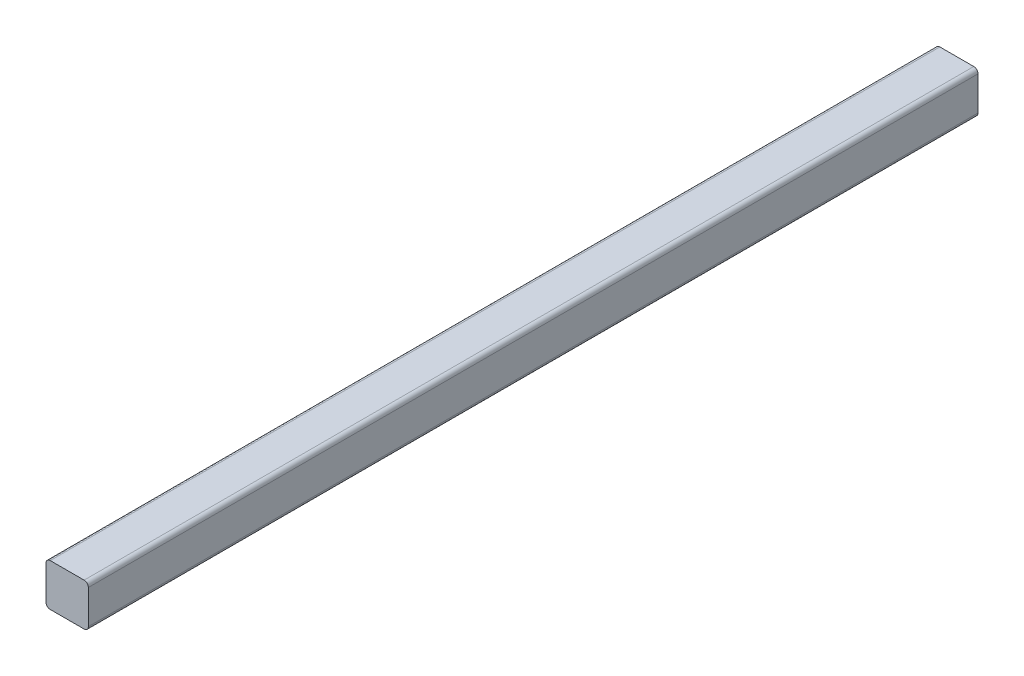
ISO-10303-21;
HEADER;
FILE_DESCRIPTION(('STEP AP214'),'2;1');
FILE_NAME('part.step','',(''),(''),'','','');
FILE_SCHEMA(('AUTOMOTIVE_DESIGN { 1 0 10303 214 1 1 1 1 }'));
ENDSEC;
DATA;
#1=APPLICATION_CONTEXT('core data for automotive mechanical design processes');
#2=APPLICATION_PROTOCOL_DEFINITION('international standard','automotive_design',2000,#1);
#3=PRODUCT_CONTEXT('',#1,'mechanical');
#4=PRODUCT('Part','Part','',(#3));
#5=PRODUCT_RELATED_PRODUCT_CATEGORY('part','',(#4));
#6=PRODUCT_DEFINITION_FORMATION('','',#4);
#7=PRODUCT_DEFINITION_CONTEXT('part definition',#1,'design');
#8=PRODUCT_DEFINITION('design','',#6,#7);
#9=PRODUCT_DEFINITION_SHAPE('','',#8);
#10=(LENGTH_UNIT() NAMED_UNIT(*) SI_UNIT(.MILLI.,.METRE.));
#11=(NAMED_UNIT(*) PLANE_ANGLE_UNIT() SI_UNIT($,.RADIAN.));
#12=(NAMED_UNIT(*) SI_UNIT($,.STERADIAN.) SOLID_ANGLE_UNIT());
#13=UNCERTAINTY_MEASURE_WITH_UNIT(LENGTH_MEASURE(1.E-05),#10,'distance_accuracy_value','');
#14=(GEOMETRIC_REPRESENTATION_CONTEXT(3) GLOBAL_UNCERTAINTY_ASSIGNED_CONTEXT((#13)) GLOBAL_UNIT_ASSIGNED_CONTEXT((#10,
#11,#12)) REPRESENTATION_CONTEXT('',''));
#15=CARTESIAN_POINT('',(0.,0.,0.));
#16=DIRECTION('',(0.,0.,1.));
#17=DIRECTION('',(1.,0.,0.));
#18=AXIS2_PLACEMENT_3D('',#15,#16,#17);
#19=CARTESIAN_POINT('',(2.5,2.5,-105.));
#20=DIRECTION('',(1.,0.,0.));
#21=DIRECTION('',(0.,1.,0.));
#22=AXIS2_PLACEMENT_3D('',#19,#20,#21);
#23=PLANE('',#22);
#24=DIRECTION('',(0.,1.,0.));
#25=VECTOR('',#24,1.);
#26=CARTESIAN_POINT('',(2.5,2.5,0.));
#27=LINE('',#26,#25);
#28=CARTESIAN_POINT('',(2.5,-2.,0.));
#29=VERTEX_POINT('',#28);
#30=CARTESIAN_POINT('',(2.5,2.,0.));
#31=VERTEX_POINT('',#30);
#32=EDGE_CURVE('E160',#29,#31,#27,.T.);
#33=ORIENTED_EDGE('',*,*,#32,.F.);
#34=DIRECTION('',(0.,0.,1.));
#35=VECTOR('',#34,1.);
#36=CARTESIAN_POINT('',(2.5,-2.,-105.));
#37=LINE('',#36,#35);
#38=CARTESIAN_POINT('',(2.5,-2.,-105.));
#39=VERTEX_POINT('',#38);
#40=EDGE_CURVE('E140',#29,#39,#37,.F.);
#41=ORIENTED_EDGE('',*,*,#40,.T.);
#42=DIRECTION('',(0.,1.,0.));
#43=VECTOR('',#42,1.);
#44=CARTESIAN_POINT('',(2.5,2.5,-105.));
#45=LINE('',#44,#43);
#46=CARTESIAN_POINT('',(2.5,2.,-105.));
#47=VERTEX_POINT('',#46);
#48=EDGE_CURVE('E121',#39,#47,#45,.T.);
#49=ORIENTED_EDGE('',*,*,#48,.T.);
#50=DIRECTION('',(0.,0.,1.));
#51=VECTOR('',#50,1.);
#52=CARTESIAN_POINT('',(2.5,2.,-105.));
#53=LINE('',#52,#51);
#54=EDGE_CURVE('E137',#47,#31,#53,.T.);
#55=ORIENTED_EDGE('',*,*,#54,.T.);
#56=EDGE_LOOP('',(#33,#41,#49,#55));
#57=FACE_BOUND('',#56,.T.);
#58=ADVANCED_FACE('F34',(#57),#23,.T.);
#59=CARTESIAN_POINT('',(-2.5,-2.5,-105.));
#60=DIRECTION('',(0.,-1.,0.));
#61=DIRECTION('',(0.,0.,-1.));
#62=AXIS2_PLACEMENT_3D('',#59,#60,#61);
#63=PLANE('',#62);
#64=DIRECTION('',(1.,0.,0.));
#65=VECTOR('',#64,1.);
#66=CARTESIAN_POINT('',(-2.5,-2.5,-105.));
#67=LINE('',#66,#65);
#68=CARTESIAN_POINT('',(-2.,-2.5,-105.));
#69=VERTEX_POINT('',#68);
#70=CARTESIAN_POINT('',(2.,-2.5,-105.));
#71=VERTEX_POINT('',#70);
#72=EDGE_CURVE('E126',#69,#71,#67,.T.);
#73=ORIENTED_EDGE('',*,*,#72,.T.);
#74=DIRECTION('',(0.,0.,1.));
#75=VECTOR('',#74,1.);
#76=CARTESIAN_POINT('',(2.,-2.5,-105.));
#77=LINE('',#76,#75);
#78=CARTESIAN_POINT('',(2.,-2.5,0.));
#79=VERTEX_POINT('',#78);
#80=EDGE_CURVE('E120',#71,#79,#77,.T.);
#81=ORIENTED_EDGE('',*,*,#80,.T.);
#82=DIRECTION('',(1.,0.,0.));
#83=VECTOR('',#82,1.);
#84=CARTESIAN_POINT('',(-2.5,-2.5,0.));
#85=LINE('',#84,#83);
#86=CARTESIAN_POINT('',(-2.,-2.5,0.));
#87=VERTEX_POINT('',#86);
#88=EDGE_CURVE('E103',#87,#79,#85,.T.);
#89=ORIENTED_EDGE('',*,*,#88,.F.);
#90=DIRECTION('',(0.,0.,1.));
#91=VECTOR('',#90,1.);
#92=CARTESIAN_POINT('',(-2.,-2.5,-105.));
#93=LINE('',#92,#91);
#94=EDGE_CURVE('E117',#87,#69,#93,.F.);
#95=ORIENTED_EDGE('',*,*,#94,.T.);
#96=EDGE_LOOP('',(#73,#81,#89,#95));
#97=FACE_BOUND('',#96,.T.);
#98=ADVANCED_FACE('F116',(#97),#63,.T.);
#99=CARTESIAN_POINT('',(-2.5,2.5,-105.));
#100=DIRECTION('',(-1.,0.,0.));
#101=DIRECTION('',(0.,-1.,0.));
#102=AXIS2_PLACEMENT_3D('',#99,#100,#101);
#103=PLANE('',#102);
#104=DIRECTION('',(0.,-1.,0.));
#105=VECTOR('',#104,1.);
#106=CARTESIAN_POINT('',(-2.5,2.5,-105.));
#107=LINE('',#106,#105);
#108=CARTESIAN_POINT('',(-2.5,2.,-105.));
#109=VERTEX_POINT('',#108);
#110=CARTESIAN_POINT('',(-2.5,-2.,-105.));
#111=VERTEX_POINT('',#110);
#112=EDGE_CURVE('E130',#109,#111,#107,.T.);
#113=ORIENTED_EDGE('',*,*,#112,.T.);
#114=DIRECTION('',(0.,0.,1.));
#115=VECTOR('',#114,1.);
#116=CARTESIAN_POINT('',(-2.5,-2.,-105.));
#117=LINE('',#116,#115);
#118=CARTESIAN_POINT('',(-2.5,-2.,0.));
#119=VERTEX_POINT('',#118);
#120=EDGE_CURVE('E150',#111,#119,#117,.T.);
#121=ORIENTED_EDGE('',*,*,#120,.T.);
#122=DIRECTION('',(0.,-1.,0.));
#123=VECTOR('',#122,1.);
#124=CARTESIAN_POINT('',(-2.5,2.5,0.));
#125=LINE('',#124,#123);
#126=CARTESIAN_POINT('',(-2.5,2.,0.));
#127=VERTEX_POINT('',#126);
#128=EDGE_CURVE('E105',#127,#119,#125,.T.);
#129=ORIENTED_EDGE('',*,*,#128,.F.);
#130=DIRECTION('',(0.,0.,1.));
#131=VECTOR('',#130,1.);
#132=CARTESIAN_POINT('',(-2.5,2.,-105.));
#133=LINE('',#132,#131);
#134=EDGE_CURVE('E148',#127,#109,#133,.F.);
#135=ORIENTED_EDGE('',*,*,#134,.T.);
#136=EDGE_LOOP('',(#113,#121,#129,#135));
#137=FACE_BOUND('',#136,.T.);
#138=ADVANCED_FACE('F153',(#137),#103,.T.);
#139=CARTESIAN_POINT('',(-2.5,2.5,-105.));
#140=DIRECTION('',(0.,1.,0.));
#141=DIRECTION('',(0.,0.,1.));
#142=AXIS2_PLACEMENT_3D('',#139,#140,#141);
#143=PLANE('',#142);
#144=DIRECTION('',(-1.,0.,0.));
#145=VECTOR('',#144,1.);
#146=CARTESIAN_POINT('',(-2.5,2.5,-105.));
#147=LINE('',#146,#145);
#148=CARTESIAN_POINT('',(2.,2.5,-105.));
#149=VERTEX_POINT('',#148);
#150=CARTESIAN_POINT('',(-2.,2.5,-105.));
#151=VERTEX_POINT('',#150);
#152=EDGE_CURVE('E155',#149,#151,#147,.T.);
#153=ORIENTED_EDGE('',*,*,#152,.T.);
#154=DIRECTION('',(0.,0.,1.));
#155=VECTOR('',#154,1.);
#156=CARTESIAN_POINT('',(-2.,2.5,-105.));
#157=LINE('',#156,#155);
#158=CARTESIAN_POINT('',(-2.,2.5,0.));
#159=VERTEX_POINT('',#158);
#160=EDGE_CURVE('E11',#151,#159,#157,.T.);
#161=ORIENTED_EDGE('',*,*,#160,.T.);
#162=DIRECTION('',(-1.,0.,0.));
#163=VECTOR('',#162,1.);
#164=CARTESIAN_POINT('',(-2.5,2.5,0.));
#165=LINE('',#164,#163);
#166=CARTESIAN_POINT('',(2.,2.5,0.));
#167=VERTEX_POINT('',#166);
#168=EDGE_CURVE('E163',#167,#159,#165,.T.);
#169=ORIENTED_EDGE('',*,*,#168,.F.);
#170=DIRECTION('',(0.,0.,1.));
#171=VECTOR('',#170,1.);
#172=CARTESIAN_POINT('',(2.,2.5,-105.));
#173=LINE('',#172,#171);
#174=EDGE_CURVE('E42',#167,#149,#173,.F.);
#175=ORIENTED_EDGE('',*,*,#174,.T.);
#176=EDGE_LOOP('',(#153,#161,#169,#175));
#177=FACE_BOUND('',#176,.T.);
#178=ADVANCED_FACE('F165',(#177),#143,.T.);
#179=CARTESIAN_POINT('',(0.,0.,-105.));
#180=DIRECTION('',(0.,0.,1.));
#181=DIRECTION('',(1.,0.,0.));
#182=AXIS2_PLACEMENT_3D('',#179,#180,#181);
#183=PLANE('',#182);
#184=ORIENTED_EDGE('',*,*,#48,.F.);
#185=CARTESIAN_POINT('',(2.,-2.,-105.));
#186=DIRECTION('',(0.,0.,1.));
#187=DIRECTION('',(1.,0.,0.));
#188=AXIS2_PLACEMENT_3D('',#185,#186,#187);
#189=CIRCLE('',#188,0.5);
#190=EDGE_CURVE('E146',#39,#71,#189,.F.);
#191=ORIENTED_EDGE('',*,*,#190,.T.);
#192=ORIENTED_EDGE('',*,*,#72,.F.);
#193=CARTESIAN_POINT('',(-2.,-2.,-105.));
#194=DIRECTION('',(0.,0.,1.));
#195=DIRECTION('',(1.,0.,0.));
#196=AXIS2_PLACEMENT_3D('',#193,#194,#195);
#197=CIRCLE('',#196,0.5);
#198=EDGE_CURVE('E125',#69,#111,#197,.F.);
#199=ORIENTED_EDGE('',*,*,#198,.T.);
#200=ORIENTED_EDGE('',*,*,#112,.F.);
#201=CARTESIAN_POINT('',(-2.,2.,-105.));
#202=DIRECTION('',(0.,0.,1.));
#203=DIRECTION('',(1.,0.,0.));
#204=AXIS2_PLACEMENT_3D('',#201,#202,#203);
#205=CIRCLE('',#204,0.5);
#206=EDGE_CURVE('E49',#109,#151,#205,.F.);
#207=ORIENTED_EDGE('',*,*,#206,.T.);
#208=ORIENTED_EDGE('',*,*,#152,.F.);
#209=CARTESIAN_POINT('',(2.,2.,-105.));
#210=DIRECTION('',(0.,0.,1.));
#211=DIRECTION('',(1.,0.,0.));
#212=AXIS2_PLACEMENT_3D('',#209,#210,#211);
#213=CIRCLE('',#212,0.5);
#214=EDGE_CURVE('E142',#149,#47,#213,.F.);
#215=ORIENTED_EDGE('',*,*,#214,.T.);
#216=EDGE_LOOP('',(#184,#191,#192,#199,#200,#207,#208,#215));
#217=FACE_BOUND('',#216,.T.);
#218=ADVANCED_FACE('F172',(#217),#183,.F.);
#219=CARTESIAN_POINT('',(0.,0.,0.));
#220=DIRECTION('',(0.,0.,1.));
#221=DIRECTION('',(1.,0.,0.));
#222=AXIS2_PLACEMENT_3D('',#219,#220,#221);
#223=PLANE('',#222);
#224=ORIENTED_EDGE('',*,*,#88,.T.);
#225=CARTESIAN_POINT('',(2.,-2.,0.));
#226=DIRECTION('',(0.,0.,1.));
#227=DIRECTION('',(1.,0.,0.));
#228=AXIS2_PLACEMENT_3D('',#225,#226,#227);
#229=CIRCLE('',#228,0.5);
#230=EDGE_CURVE('E110',#79,#29,#229,.T.);
#231=ORIENTED_EDGE('',*,*,#230,.T.);
#232=ORIENTED_EDGE('',*,*,#32,.T.);
#233=CARTESIAN_POINT('',(2.,2.,0.));
#234=DIRECTION('',(0.,0.,1.));
#235=DIRECTION('',(1.,0.,0.));
#236=AXIS2_PLACEMENT_3D('',#233,#234,#235);
#237=CIRCLE('',#236,0.5);
#238=EDGE_CURVE('E128',#31,#167,#237,.T.);
#239=ORIENTED_EDGE('',*,*,#238,.T.);
#240=ORIENTED_EDGE('',*,*,#168,.T.);
#241=CARTESIAN_POINT('',(-2.,2.,0.));
#242=DIRECTION('',(0.,0.,1.));
#243=DIRECTION('',(1.,0.,0.));
#244=AXIS2_PLACEMENT_3D('',#241,#242,#243);
#245=CIRCLE('',#244,0.5);
#246=EDGE_CURVE('E111',#159,#127,#245,.T.);
#247=ORIENTED_EDGE('',*,*,#246,.T.);
#248=ORIENTED_EDGE('',*,*,#128,.T.);
#249=CARTESIAN_POINT('',(-2.,-2.,0.));
#250=DIRECTION('',(0.,0.,1.));
#251=DIRECTION('',(1.,0.,0.));
#252=AXIS2_PLACEMENT_3D('',#249,#250,#251);
#253=CIRCLE('',#252,0.5);
#254=EDGE_CURVE('E100',#119,#87,#253,.T.);
#255=ORIENTED_EDGE('',*,*,#254,.T.);
#256=EDGE_LOOP('',(#224,#231,#232,#239,#240,#247,#248,#255));
#257=FACE_BOUND('',#256,.T.);
#258=ADVANCED_FACE('F102',(#257),#223,.T.);
#259=CARTESIAN_POINT('',(2.,-2.,-105.));
#260=DIRECTION('',(0.,0.,1.));
#261=DIRECTION('',(1.,0.,0.));
#262=AXIS2_PLACEMENT_3D('',#259,#260,#261);
#263=CYLINDRICAL_SURFACE('',#262,0.5);
#264=ORIENTED_EDGE('',*,*,#190,.F.);
#265=ORIENTED_EDGE('',*,*,#40,.F.);
#266=ORIENTED_EDGE('',*,*,#230,.F.);
#267=ORIENTED_EDGE('',*,*,#80,.F.);
#268=EDGE_LOOP('',(#264,#265,#266,#267));
#269=FACE_BOUND('',#268,.T.);
#270=ADVANCED_FACE('F178',(#269),#263,.T.);
#271=CARTESIAN_POINT('',(-2.,-2.,-105.));
#272=DIRECTION('',(0.,0.,1.));
#273=DIRECTION('',(1.,0.,0.));
#274=AXIS2_PLACEMENT_3D('',#271,#272,#273);
#275=CYLINDRICAL_SURFACE('',#274,0.5);
#276=ORIENTED_EDGE('',*,*,#198,.F.);
#277=ORIENTED_EDGE('',*,*,#94,.F.);
#278=ORIENTED_EDGE('',*,*,#254,.F.);
#279=ORIENTED_EDGE('',*,*,#120,.F.);
#280=EDGE_LOOP('',(#276,#277,#278,#279));
#281=FACE_BOUND('',#280,.T.);
#282=ADVANCED_FACE('F124',(#281),#275,.T.);
#283=CARTESIAN_POINT('',(-2.,2.,-105.));
#284=DIRECTION('',(0.,0.,1.));
#285=DIRECTION('',(1.,0.,0.));
#286=AXIS2_PLACEMENT_3D('',#283,#284,#285);
#287=CYLINDRICAL_SURFACE('',#286,0.5);
#288=ORIENTED_EDGE('',*,*,#206,.F.);
#289=ORIENTED_EDGE('',*,*,#134,.F.);
#290=ORIENTED_EDGE('',*,*,#246,.F.);
#291=ORIENTED_EDGE('',*,*,#160,.F.);
#292=EDGE_LOOP('',(#288,#289,#290,#291));
#293=FACE_BOUND('',#292,.T.);
#294=ADVANCED_FACE('F185',(#293),#287,.T.);
#295=CARTESIAN_POINT('',(2.,2.,-105.));
#296=DIRECTION('',(0.,0.,1.));
#297=DIRECTION('',(1.,0.,0.));
#298=AXIS2_PLACEMENT_3D('',#295,#296,#297);
#299=CYLINDRICAL_SURFACE('',#298,0.5);
#300=ORIENTED_EDGE('',*,*,#214,.F.);
#301=ORIENTED_EDGE('',*,*,#174,.F.);
#302=ORIENTED_EDGE('',*,*,#238,.F.);
#303=ORIENTED_EDGE('',*,*,#54,.F.);
#304=EDGE_LOOP('',(#300,#301,#302,#303));
#305=FACE_BOUND('',#304,.T.);
#306=ADVANCED_FACE('F36',(#305),#299,.T.);
#307=CLOSED_SHELL('',(#58,#98,#138,#178,#218,#258,#270,#282,#294,#306));
#308=MANIFOLD_SOLID_BREP('B2',#307);
#309=ADVANCED_BREP_SHAPE_REPRESENTATION('',(#18,#308),#14);
#310=SHAPE_DEFINITION_REPRESENTATION(#9,#309);
ENDSEC;
END-ISO-10303-21;
